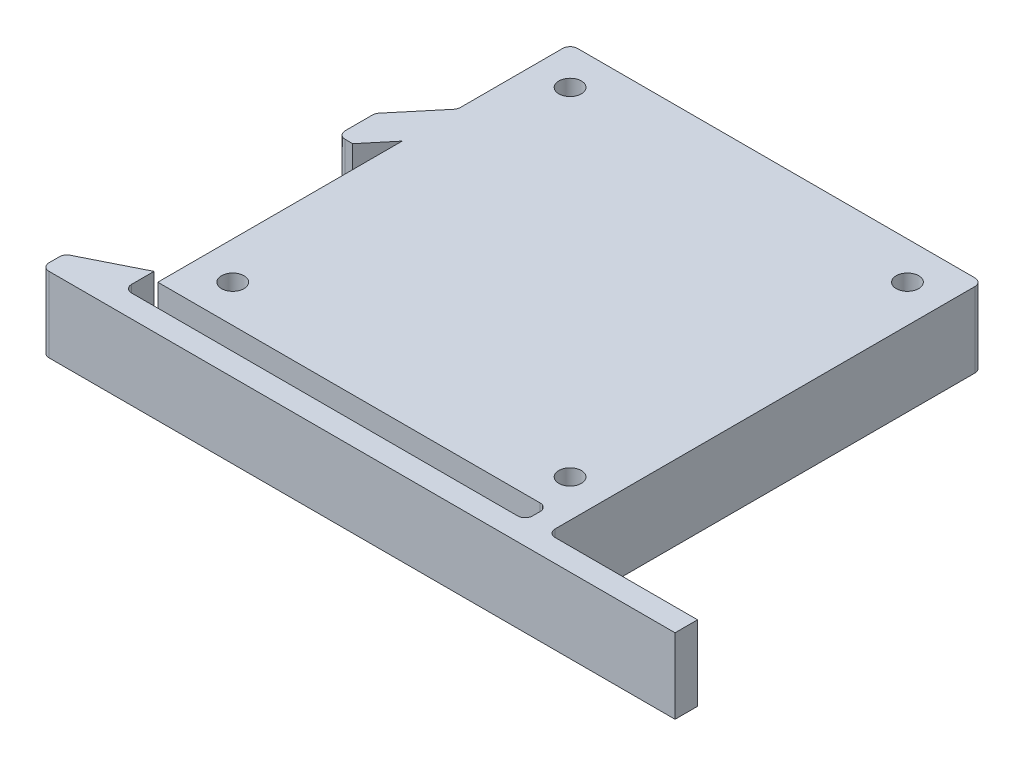
ISO-10303-21;
HEADER;
FILE_DESCRIPTION(('STEP AP214'),'2;1');
FILE_NAME('part.step','',(''),(''),'','','');
FILE_SCHEMA(('AUTOMOTIVE_DESIGN { 1 0 10303 214 1 1 1 1 }'));
ENDSEC;
DATA;
#1=APPLICATION_CONTEXT('core data for automotive mechanical design processes');
#2=APPLICATION_PROTOCOL_DEFINITION('international standard','automotive_design',2000,#1);
#3=PRODUCT_CONTEXT('',#1,'mechanical');
#4=PRODUCT('Part','Part','',(#3));
#5=PRODUCT_RELATED_PRODUCT_CATEGORY('part','',(#4));
#6=PRODUCT_DEFINITION_FORMATION('','',#4);
#7=PRODUCT_DEFINITION_CONTEXT('part definition',#1,'design');
#8=PRODUCT_DEFINITION('design','',#6,#7);
#9=PRODUCT_DEFINITION_SHAPE('','',#8);
#10=(LENGTH_UNIT() NAMED_UNIT(*) SI_UNIT(.MILLI.,.METRE.));
#11=(NAMED_UNIT(*) PLANE_ANGLE_UNIT() SI_UNIT($,.RADIAN.));
#12=(NAMED_UNIT(*) SI_UNIT($,.STERADIAN.) SOLID_ANGLE_UNIT());
#13=UNCERTAINTY_MEASURE_WITH_UNIT(LENGTH_MEASURE(1.E-05),#10,'distance_accuracy_value','');
#14=(GEOMETRIC_REPRESENTATION_CONTEXT(3) GLOBAL_UNCERTAINTY_ASSIGNED_CONTEXT((#13)) GLOBAL_UNIT_ASSIGNED_CONTEXT((#10,
#11,#12)) REPRESENTATION_CONTEXT('',''));
#15=CARTESIAN_POINT('',(0.,0.,0.));
#16=DIRECTION('',(0.,0.,1.));
#17=DIRECTION('',(1.,0.,0.));
#18=AXIS2_PLACEMENT_3D('',#15,#16,#17);
#19=CARTESIAN_POINT('',(51.,10.,-5.));
#20=DIRECTION('',(0.,-1.,0.));
#21=DIRECTION('',(0.,0.,-1.));
#22=AXIS2_PLACEMENT_3D('',#19,#20,#21);
#23=PLANE('',#22);
#24=DIRECTION('',(0.640184399664479,0.,-0.768221279597376));
#25=VECTOR('',#24,1.);
#26=CARTESIAN_POINT('',(-3.,10.,-35.));
#27=LINE('',#26,#25);
#28=CARTESIAN_POINT('',(-3.,10.,-35.));
#29=VERTEX_POINT('',#28);
#30=CARTESIAN_POINT('',(0.,10.,-38.6));
#31=VERTEX_POINT('',#30);
#32=EDGE_CURVE('E311',#29,#31,#27,.T.);
#33=ORIENTED_EDGE('',*,*,#32,.T.);
#34=DIRECTION('',(0.,0.,1.));
#35=VECTOR('',#34,1.);
#36=CARTESIAN_POINT('',(0.,10.,-38.6));
#37=LINE('',#36,#35);
#38=CARTESIAN_POINT('',(0.,10.,-6.));
#39=VERTEX_POINT('',#38);
#40=EDGE_CURVE('E159',#31,#39,#37,.T.);
#41=ORIENTED_EDGE('',*,*,#40,.T.);
#42=DIRECTION('',(1.,0.,0.));
#43=VECTOR('',#42,1.);
#44=CARTESIAN_POINT('',(0.,10.,-6.));
#45=LINE('',#44,#43);
#46=CARTESIAN_POINT('',(51.,10.,-6.));
#47=VERTEX_POINT('',#46);
#48=EDGE_CURVE('E386',#39,#47,#45,.T.);
#49=ORIENTED_EDGE('',*,*,#48,.T.);
#50=CARTESIAN_POINT('',(51.,10.,-5.));
#51=DIRECTION('',(0.,-1.,0.));
#52=DIRECTION('',(0.,0.,-1.));
#53=AXIS2_PLACEMENT_3D('',#50,#51,#52);
#54=CIRCLE('',#53,1.);
#55=CARTESIAN_POINT('',(52.,10.,-5.));
#56=VERTEX_POINT('',#55);
#57=EDGE_CURVE('E405',#47,#56,#54,.T.);
#58=ORIENTED_EDGE('',*,*,#57,.T.);
#59=DIRECTION('',(0.,0.,1.));
#60=VECTOR('',#59,1.);
#61=CARTESIAN_POINT('',(52.,10.,-4.));
#62=LINE('',#61,#60);
#63=CARTESIAN_POINT('',(52.,10.,-4.));
#64=VERTEX_POINT('',#63);
#65=EDGE_CURVE('E402',#56,#64,#62,.T.);
#66=ORIENTED_EDGE('',*,*,#65,.T.);
#67=CARTESIAN_POINT('',(51.,10.,-4.));
#68=DIRECTION('',(0.,-1.,0.));
#69=DIRECTION('',(0.,0.,-1.));
#70=AXIS2_PLACEMENT_3D('',#67,#68,#69);
#71=CIRCLE('',#70,1.);
#72=CARTESIAN_POINT('',(51.,10.,-3.));
#73=VERTEX_POINT('',#72);
#74=EDGE_CURVE('E404',#64,#73,#71,.T.);
#75=ORIENTED_EDGE('',*,*,#74,.T.);
#76=DIRECTION('',(-1.,0.,0.));
#77=VECTOR('',#76,1.);
#78=CARTESIAN_POINT('',(51.,10.,-3.));
#79=LINE('',#78,#77);
#80=CARTESIAN_POINT('',(-0.499999999999995,10.,-2.99999999999999));
#81=VERTEX_POINT('',#80);
#82=EDGE_CURVE('E407',#73,#81,#79,.T.);
#83=ORIENTED_EDGE('',*,*,#82,.T.);
#84=CARTESIAN_POINT('',(-0.499999999999995,10.,-3.99999999999999));
#85=DIRECTION('',(0.,-1.,0.));
#86=DIRECTION('',(0.,0.,-1.));
#87=AXIS2_PLACEMENT_3D('',#84,#85,#86);
#88=CIRCLE('',#87,1.);
#89=CARTESIAN_POINT('',(-1.5,10.,-3.99999999999999));
#90=VERTEX_POINT('',#89);
#91=EDGE_CURVE('E413',#81,#90,#88,.T.);
#92=ORIENTED_EDGE('',*,*,#91,.T.);
#93=DIRECTION('',(0.,0.,-1.));
#94=VECTOR('',#93,1.);
#95=CARTESIAN_POINT('',(-1.5,10.,-3.99999999999999));
#96=LINE('',#95,#94);
#97=CARTESIAN_POINT('',(-1.5,10.,-7.));
#98=VERTEX_POINT('',#97);
#99=EDGE_CURVE('E415',#90,#98,#96,.T.);
#100=ORIENTED_EDGE('',*,*,#99,.T.);
#101=DIRECTION('',(-0.894427190999916,0.,0.447213595499957));
#102=VECTOR('',#101,1.);
#103=CARTESIAN_POINT('',(-1.5,10.,-7.));
#104=LINE('',#103,#102);
#105=CARTESIAN_POINT('',(-8.94721359549995,10.,-3.27639320225004));
#106=VERTEX_POINT('',#105);
#107=EDGE_CURVE('E417',#98,#106,#104,.T.);
#108=ORIENTED_EDGE('',*,*,#107,.T.);
#109=CARTESIAN_POINT('',(-8.5,10.,-2.38196601125012));
#110=DIRECTION('',(0.,1.,0.));
#111=DIRECTION('',(0.,0.,1.));
#112=AXIS2_PLACEMENT_3D('',#109,#110,#111);
#113=CIRCLE('',#112,0.999999999999999);
#114=CARTESIAN_POINT('',(-9.5,10.,-2.38196601125011));
#115=VERTEX_POINT('',#114);
#116=EDGE_CURVE('E419',#106,#115,#113,.T.);
#117=ORIENTED_EDGE('',*,*,#116,.T.);
#118=DIRECTION('',(0.,0.,1.));
#119=VECTOR('',#118,1.);
#120=CARTESIAN_POINT('',(-9.5,10.,-1.00000000000001));
#121=LINE('',#120,#119);
#122=CARTESIAN_POINT('',(-9.5,10.,-1.00000000000001));
#123=VERTEX_POINT('',#122);
#124=EDGE_CURVE('E421',#115,#123,#121,.T.);
#125=ORIENTED_EDGE('',*,*,#124,.T.);
#126=CARTESIAN_POINT('',(-8.5,10.,-1.));
#127=DIRECTION('',(0.,1.,0.));
#128=DIRECTION('',(0.,0.,-1.));
#129=AXIS2_PLACEMENT_3D('',#126,#127,#128);
#130=CIRCLE('',#129,1.);
#131=CARTESIAN_POINT('',(-8.49999999999999,10.,0.));
#132=VERTEX_POINT('',#131);
#133=EDGE_CURVE('E423',#123,#132,#130,.T.);
#134=ORIENTED_EDGE('',*,*,#133,.T.);
#135=DIRECTION('',(1.,0.,0.));
#136=VECTOR('',#135,1.);
#137=CARTESIAN_POINT('',(75.,10.,0.));
#138=LINE('',#137,#136);
#139=CARTESIAN_POINT('',(75.,10.,0.));
#140=VERTEX_POINT('',#139);
#141=EDGE_CURVE('E425',#132,#140,#138,.T.);
#142=ORIENTED_EDGE('',*,*,#141,.T.);
#143=DIRECTION('',(0.,0.,-1.));
#144=VECTOR('',#143,1.);
#145=CARTESIAN_POINT('',(75.,10.,0.));
#146=LINE('',#145,#144);
#147=CARTESIAN_POINT('',(75.,10.,-3.));
#148=VERTEX_POINT('',#147);
#149=EDGE_CURVE('E427',#140,#148,#146,.T.);
#150=ORIENTED_EDGE('',*,*,#149,.T.);
#151=DIRECTION('',(-1.,0.,0.));
#152=VECTOR('',#151,1.);
#153=CARTESIAN_POINT('',(75.,10.,-3.));
#154=LINE('',#153,#152);
#155=CARTESIAN_POINT('',(56.,10.,-3.));
#156=VERTEX_POINT('',#155);
#157=EDGE_CURVE('E429',#148,#156,#154,.T.);
#158=ORIENTED_EDGE('',*,*,#157,.T.);
#159=CARTESIAN_POINT('',(56.,10.,-4.));
#160=DIRECTION('',(0.,-1.,0.));
#161=DIRECTION('',(0.,0.,-1.));
#162=AXIS2_PLACEMENT_3D('',#159,#160,#161);
#163=CIRCLE('',#162,1.);
#164=CARTESIAN_POINT('',(55.,10.,-4.));
#165=VERTEX_POINT('',#164);
#166=EDGE_CURVE('E431',#156,#165,#163,.T.);
#167=ORIENTED_EDGE('',*,*,#166,.T.);
#168=DIRECTION('',(0.,0.,-1.));
#169=VECTOR('',#168,1.);
#170=CARTESIAN_POINT('',(55.,10.,-4.));
#171=LINE('',#170,#169);
#172=CARTESIAN_POINT('',(55.,10.,-60.));
#173=VERTEX_POINT('',#172);
#174=EDGE_CURVE('E433',#165,#173,#171,.T.);
#175=ORIENTED_EDGE('',*,*,#174,.T.);
#176=CARTESIAN_POINT('',(54.,10.,-60.));
#177=DIRECTION('',(0.,1.,0.));
#178=DIRECTION('',(0.,0.,1.));
#179=AXIS2_PLACEMENT_3D('',#176,#177,#178);
#180=CIRCLE('',#179,0.999999999999997);
#181=CARTESIAN_POINT('',(54.,10.,-61.));
#182=VERTEX_POINT('',#181);
#183=EDGE_CURVE('E435',#173,#182,#180,.T.);
#184=ORIENTED_EDGE('',*,*,#183,.T.);
#185=DIRECTION('',(-1.,0.,0.));
#186=VECTOR('',#185,1.);
#187=CARTESIAN_POINT('',(54.,10.,-61.));
#188=LINE('',#187,#186);
#189=CARTESIAN_POINT('',(1.,10.,-61.));
#190=VERTEX_POINT('',#189);
#191=EDGE_CURVE('E437',#182,#190,#188,.T.);
#192=ORIENTED_EDGE('',*,*,#191,.T.);
#193=CARTESIAN_POINT('',(1.,10.,-60.));
#194=DIRECTION('',(0.,1.,0.));
#195=DIRECTION('',(0.,0.,1.));
#196=AXIS2_PLACEMENT_3D('',#193,#194,#195);
#197=CIRCLE('',#196,1.);
#198=CARTESIAN_POINT('',(0.,10.,-60.));
#199=VERTEX_POINT('',#198);
#200=EDGE_CURVE('E439',#190,#199,#197,.T.);
#201=ORIENTED_EDGE('',*,*,#200,.T.);
#202=DIRECTION('',(0.,0.,1.));
#203=VECTOR('',#202,1.);
#204=CARTESIAN_POINT('',(0.,10.,-60.));
#205=LINE('',#204,#203);
#206=CARTESIAN_POINT('',(0.,10.,-46.3620499351813));
#207=VERTEX_POINT('',#206);
#208=EDGE_CURVE('E441',#199,#207,#205,.T.);
#209=ORIENTED_EDGE('',*,*,#208,.T.);
#210=CARTESIAN_POINT('',(-0.999999999999998,10.,-46.3620499351813));
#211=DIRECTION('',(0.,-1.,0.));
#212=DIRECTION('',(0.,0.,-1.));
#213=AXIS2_PLACEMENT_3D('',#210,#211,#212);
#214=CIRCLE('',#213,0.999999999999997);
#215=CARTESIAN_POINT('',(-0.231778720402629,10.,-45.7218655355168));
#216=VERTEX_POINT('',#215);
#217=EDGE_CURVE('E443',#207,#216,#214,.T.);
#218=ORIENTED_EDGE('',*,*,#217,.T.);
#219=DIRECTION('',(-0.640184399664479,0.,0.768221279597376));
#220=VECTOR('',#219,1.);
#221=CARTESIAN_POINT('',(-0.231778720402629,10.,-45.7218655355168));
#222=LINE('',#221,#220);
#223=CARTESIAN_POINT('',(-4.76822127959737,10.,-40.2781344644831));
#224=VERTEX_POINT('',#223);
#225=EDGE_CURVE('E445',#216,#224,#222,.T.);
#226=ORIENTED_EDGE('',*,*,#225,.T.);
#227=CARTESIAN_POINT('',(-4.,10.,-39.6379500648187));
#228=DIRECTION('',(0.,1.,0.));
#229=DIRECTION('',(0.,0.,1.));
#230=AXIS2_PLACEMENT_3D('',#227,#228,#229);
#231=CIRCLE('',#230,0.999999999999997);
#232=CARTESIAN_POINT('',(-5.,10.,-39.6379500648187));
#233=VERTEX_POINT('',#232);
#234=EDGE_CURVE('E238',#224,#233,#231,.T.);
#235=ORIENTED_EDGE('',*,*,#234,.T.);
#236=DIRECTION('',(0.,0.,1.));
#237=VECTOR('',#236,1.);
#238=CARTESIAN_POINT('',(-5.,10.,-39.6379500648187));
#239=LINE('',#238,#237);
#240=CARTESIAN_POINT('',(-5.,10.,-36.));
#241=VERTEX_POINT('',#240);
#242=EDGE_CURVE('E232',#233,#241,#239,.T.);
#243=ORIENTED_EDGE('',*,*,#242,.T.);
#244=CARTESIAN_POINT('',(-4.,10.,-36.));
#245=DIRECTION('',(0.,1.,0.));
#246=DIRECTION('',(0.,0.,1.));
#247=AXIS2_PLACEMENT_3D('',#244,#245,#246);
#248=CIRCLE('',#247,1.);
#249=CARTESIAN_POINT('',(-4.,10.,-35.));
#250=VERTEX_POINT('',#249);
#251=EDGE_CURVE('E236',#241,#250,#248,.T.);
#252=ORIENTED_EDGE('',*,*,#251,.T.);
#253=DIRECTION('',(1.,0.,0.));
#254=VECTOR('',#253,1.);
#255=CARTESIAN_POINT('',(-4.,10.,-35.));
#256=LINE('',#255,#254);
#257=EDGE_CURVE('E56',#250,#29,#256,.T.);
#258=ORIENTED_EDGE('',*,*,#257,.T.);
#259=EDGE_LOOP('',(#33,#41,#49,#58,#66,#75,#83,#92,#100,#108,#117,#125,#134,#142,#150,#158,#167,
#175,#184,#192,#201,#209,#218,#226,#235,#243,#252,#258));
#260=FACE_BOUND('',#259,.T.);
#261=CARTESIAN_POINT('',(5.,10.,-56.));
#262=DIRECTION('',(0.,1.,0.));
#263=DIRECTION('',(0.,0.,1.));
#264=AXIS2_PLACEMENT_3D('',#261,#262,#263);
#265=CIRCLE('',#264,1.5);
#266=CARTESIAN_POINT('',(5.,10.,-54.5));
#267=VERTEX_POINT('',#266);
#268=EDGE_CURVE('E260',#267,#267,#265,.T.);
#269=ORIENTED_EDGE('',*,*,#268,.F.);
#270=EDGE_LOOP('',(#269));
#271=FACE_BOUND('',#270,.T.);
#272=CARTESIAN_POINT('',(50.,10.,-56.));
#273=DIRECTION('',(0.,1.,0.));
#274=DIRECTION('',(0.,0.,1.));
#275=AXIS2_PLACEMENT_3D('',#272,#273,#274);
#276=CIRCLE('',#275,1.5);
#277=CARTESIAN_POINT('',(50.,10.,-54.5));
#278=VERTEX_POINT('',#277);
#279=EDGE_CURVE('E509',#278,#278,#276,.T.);
#280=ORIENTED_EDGE('',*,*,#279,.F.);
#281=EDGE_LOOP('',(#280));
#282=FACE_BOUND('',#281,.T.);
#283=CARTESIAN_POINT('',(5.,10.,-11.));
#284=DIRECTION('',(0.,1.,0.));
#285=DIRECTION('',(0.,0.,1.));
#286=AXIS2_PLACEMENT_3D('',#283,#284,#285);
#287=CIRCLE('',#286,1.5);
#288=CARTESIAN_POINT('',(5.,10.,-9.49999999999999));
#289=VERTEX_POINT('',#288);
#290=EDGE_CURVE('E503',#289,#289,#287,.T.);
#291=ORIENTED_EDGE('',*,*,#290,.F.);
#292=EDGE_LOOP('',(#291));
#293=FACE_BOUND('',#292,.T.);
#294=CARTESIAN_POINT('',(50.,10.,-11.));
#295=DIRECTION('',(0.,1.,0.));
#296=DIRECTION('',(0.,0.,1.));
#297=AXIS2_PLACEMENT_3D('',#294,#295,#296);
#298=CIRCLE('',#297,1.5);
#299=CARTESIAN_POINT('',(50.,10.,-9.49999999999998));
#300=VERTEX_POINT('',#299);
#301=EDGE_CURVE('E494',#300,#300,#298,.T.);
#302=ORIENTED_EDGE('',*,*,#301,.F.);
#303=EDGE_LOOP('',(#302));
#304=FACE_BOUND('',#303,.T.);
#305=ADVANCED_FACE('F39',(#260,#271,#282,#293,#304),#23,.F.);
#306=CARTESIAN_POINT('',(51.,0.,-5.));
#307=DIRECTION('',(0.,-1.,0.));
#308=DIRECTION('',(0.,0.,-1.));
#309=AXIS2_PLACEMENT_3D('',#306,#307,#308);
#310=PLANE('',#309);
#311=CARTESIAN_POINT('',(5.,0.,-11.));
#312=DIRECTION('',(0.,1.,0.));
#313=DIRECTION('',(0.,0.,1.));
#314=AXIS2_PLACEMENT_3D('',#311,#312,#313);
#315=CIRCLE('',#314,1.5);
#316=CARTESIAN_POINT('',(5.,0.,-9.49999999999999));
#317=VERTEX_POINT('',#316);
#318=EDGE_CURVE('E500',#317,#317,#315,.T.);
#319=ORIENTED_EDGE('',*,*,#318,.T.);
#320=EDGE_LOOP('',(#319));
#321=FACE_BOUND('',#320,.T.);
#322=CARTESIAN_POINT('',(5.,0.,-56.));
#323=DIRECTION('',(0.,1.,0.));
#324=DIRECTION('',(0.,0.,1.));
#325=AXIS2_PLACEMENT_3D('',#322,#323,#324);
#326=CIRCLE('',#325,1.5);
#327=CARTESIAN_POINT('',(5.,0.,-54.5));
#328=VERTEX_POINT('',#327);
#329=EDGE_CURVE('E512',#328,#328,#326,.T.);
#330=ORIENTED_EDGE('',*,*,#329,.T.);
#331=EDGE_LOOP('',(#330));
#332=FACE_BOUND('',#331,.T.);
#333=DIRECTION('',(0.640184399664479,0.,-0.768221279597376));
#334=VECTOR('',#333,1.);
#335=CARTESIAN_POINT('',(-3.,0.,-35.));
#336=LINE('',#335,#334);
#337=CARTESIAN_POINT('',(-3.,0.,-35.));
#338=VERTEX_POINT('',#337);
#339=CARTESIAN_POINT('',(0.,0.,-38.6));
#340=VERTEX_POINT('',#339);
#341=EDGE_CURVE('E256',#338,#340,#336,.T.);
#342=ORIENTED_EDGE('',*,*,#341,.F.);
#343=DIRECTION('',(1.,0.,0.));
#344=VECTOR('',#343,1.);
#345=CARTESIAN_POINT('',(-4.,0.,-35.));
#346=LINE('',#345,#344);
#347=CARTESIAN_POINT('',(-4.,0.,-35.));
#348=VERTEX_POINT('',#347);
#349=EDGE_CURVE('E151',#348,#338,#346,.T.);
#350=ORIENTED_EDGE('',*,*,#349,.F.);
#351=CARTESIAN_POINT('',(-4.,0.,-36.));
#352=DIRECTION('',(0.,1.,0.));
#353=DIRECTION('',(0.,0.,1.));
#354=AXIS2_PLACEMENT_3D('',#351,#352,#353);
#355=CIRCLE('',#354,1.);
#356=CARTESIAN_POINT('',(-5.,0.,-36.));
#357=VERTEX_POINT('',#356);
#358=EDGE_CURVE('E145',#357,#348,#355,.T.);
#359=ORIENTED_EDGE('',*,*,#358,.F.);
#360=DIRECTION('',(0.,0.,1.));
#361=VECTOR('',#360,1.);
#362=CARTESIAN_POINT('',(-5.,0.,-39.6379500648187));
#363=LINE('',#362,#361);
#364=CARTESIAN_POINT('',(-5.,0.,-39.6379500648187));
#365=VERTEX_POINT('',#364);
#366=EDGE_CURVE('E246',#365,#357,#363,.T.);
#367=ORIENTED_EDGE('',*,*,#366,.F.);
#368=CARTESIAN_POINT('',(-4.,0.,-39.6379500648187));
#369=DIRECTION('',(0.,1.,0.));
#370=DIRECTION('',(0.,0.,1.));
#371=AXIS2_PLACEMENT_3D('',#368,#369,#370);
#372=CIRCLE('',#371,0.999999999999997);
#373=CARTESIAN_POINT('',(-4.76822127959737,0.,-40.2781344644831));
#374=VERTEX_POINT('',#373);
#375=EDGE_CURVE('E306',#374,#365,#372,.T.);
#376=ORIENTED_EDGE('',*,*,#375,.F.);
#377=DIRECTION('',(-0.640184399664479,0.,0.768221279597376));
#378=VECTOR('',#377,1.);
#379=CARTESIAN_POINT('',(-0.231778720402629,0.,-45.7218655355168));
#380=LINE('',#379,#378);
#381=CARTESIAN_POINT('',(-0.231778720402629,0.,-45.7218655355168));
#382=VERTEX_POINT('',#381);
#383=EDGE_CURVE('E304',#382,#374,#380,.T.);
#384=ORIENTED_EDGE('',*,*,#383,.F.);
#385=CARTESIAN_POINT('',(-0.999999999999998,0.,-46.3620499351813));
#386=DIRECTION('',(0.,-1.,0.));
#387=DIRECTION('',(0.,0.,-1.));
#388=AXIS2_PLACEMENT_3D('',#385,#386,#387);
#389=CIRCLE('',#388,0.999999999999997);
#390=CARTESIAN_POINT('',(0.,0.,-46.3620499351813));
#391=VERTEX_POINT('',#390);
#392=EDGE_CURVE('E302',#391,#382,#389,.T.);
#393=ORIENTED_EDGE('',*,*,#392,.F.);
#394=DIRECTION('',(0.,0.,1.));
#395=VECTOR('',#394,1.);
#396=CARTESIAN_POINT('',(0.,0.,-60.));
#397=LINE('',#396,#395);
#398=CARTESIAN_POINT('',(0.,0.,-60.));
#399=VERTEX_POINT('',#398);
#400=EDGE_CURVE('E300',#399,#391,#397,.T.);
#401=ORIENTED_EDGE('',*,*,#400,.F.);
#402=CARTESIAN_POINT('',(1.,0.,-60.));
#403=DIRECTION('',(0.,1.,0.));
#404=DIRECTION('',(0.,0.,1.));
#405=AXIS2_PLACEMENT_3D('',#402,#403,#404);
#406=CIRCLE('',#405,1.);
#407=CARTESIAN_POINT('',(1.,0.,-61.));
#408=VERTEX_POINT('',#407);
#409=EDGE_CURVE('E298',#408,#399,#406,.T.);
#410=ORIENTED_EDGE('',*,*,#409,.F.);
#411=DIRECTION('',(-1.,0.,0.));
#412=VECTOR('',#411,1.);
#413=CARTESIAN_POINT('',(54.,0.,-61.));
#414=LINE('',#413,#412);
#415=CARTESIAN_POINT('',(54.,0.,-61.));
#416=VERTEX_POINT('',#415);
#417=EDGE_CURVE('E296',#416,#408,#414,.T.);
#418=ORIENTED_EDGE('',*,*,#417,.F.);
#419=CARTESIAN_POINT('',(54.,0.,-60.));
#420=DIRECTION('',(0.,1.,0.));
#421=DIRECTION('',(0.,0.,1.));
#422=AXIS2_PLACEMENT_3D('',#419,#420,#421);
#423=CIRCLE('',#422,0.999999999999997);
#424=CARTESIAN_POINT('',(55.,0.,-60.));
#425=VERTEX_POINT('',#424);
#426=EDGE_CURVE('E294',#425,#416,#423,.T.);
#427=ORIENTED_EDGE('',*,*,#426,.F.);
#428=DIRECTION('',(0.,0.,-1.));
#429=VECTOR('',#428,1.);
#430=CARTESIAN_POINT('',(55.,0.,-4.));
#431=LINE('',#430,#429);
#432=CARTESIAN_POINT('',(55.,0.,-4.));
#433=VERTEX_POINT('',#432);
#434=EDGE_CURVE('E292',#433,#425,#431,.T.);
#435=ORIENTED_EDGE('',*,*,#434,.F.);
#436=CARTESIAN_POINT('',(56.,0.,-4.));
#437=DIRECTION('',(0.,-1.,0.));
#438=DIRECTION('',(0.,0.,-1.));
#439=AXIS2_PLACEMENT_3D('',#436,#437,#438);
#440=CIRCLE('',#439,1.);
#441=CARTESIAN_POINT('',(56.,0.,-3.));
#442=VERTEX_POINT('',#441);
#443=EDGE_CURVE('E290',#442,#433,#440,.T.);
#444=ORIENTED_EDGE('',*,*,#443,.F.);
#445=DIRECTION('',(-1.,0.,0.));
#446=VECTOR('',#445,1.);
#447=CARTESIAN_POINT('',(75.,0.,-3.));
#448=LINE('',#447,#446);
#449=CARTESIAN_POINT('',(75.,0.,-3.));
#450=VERTEX_POINT('',#449);
#451=EDGE_CURVE('E288',#450,#442,#448,.T.);
#452=ORIENTED_EDGE('',*,*,#451,.F.);
#453=DIRECTION('',(0.,0.,-1.));
#454=VECTOR('',#453,1.);
#455=CARTESIAN_POINT('',(75.,0.,0.));
#456=LINE('',#455,#454);
#457=CARTESIAN_POINT('',(75.,0.,0.));
#458=VERTEX_POINT('',#457);
#459=EDGE_CURVE('E286',#458,#450,#456,.T.);
#460=ORIENTED_EDGE('',*,*,#459,.F.);
#461=DIRECTION('',(1.,0.,0.));
#462=VECTOR('',#461,1.);
#463=CARTESIAN_POINT('',(75.,0.,0.));
#464=LINE('',#463,#462);
#465=CARTESIAN_POINT('',(-8.49999999999999,0.,0.));
#466=VERTEX_POINT('',#465);
#467=EDGE_CURVE('E284',#466,#458,#464,.T.);
#468=ORIENTED_EDGE('',*,*,#467,.F.);
#469=CARTESIAN_POINT('',(-8.5,0.,-1.));
#470=DIRECTION('',(0.,1.,0.));
#471=DIRECTION('',(0.,0.,-1.));
#472=AXIS2_PLACEMENT_3D('',#469,#470,#471);
#473=CIRCLE('',#472,1.);
#474=CARTESIAN_POINT('',(-9.5,0.,-1.00000000000001));
#475=VERTEX_POINT('',#474);
#476=EDGE_CURVE('E282',#475,#466,#473,.T.);
#477=ORIENTED_EDGE('',*,*,#476,.F.);
#478=DIRECTION('',(0.,0.,1.));
#479=VECTOR('',#478,1.);
#480=CARTESIAN_POINT('',(-9.5,0.,-1.00000000000001));
#481=LINE('',#480,#479);
#482=CARTESIAN_POINT('',(-9.5,0.,-2.38196601125011));
#483=VERTEX_POINT('',#482);
#484=EDGE_CURVE('E280',#483,#475,#481,.T.);
#485=ORIENTED_EDGE('',*,*,#484,.F.);
#486=CARTESIAN_POINT('',(-8.5,0.,-2.38196601125012));
#487=DIRECTION('',(0.,1.,0.));
#488=DIRECTION('',(0.,0.,1.));
#489=AXIS2_PLACEMENT_3D('',#486,#487,#488);
#490=CIRCLE('',#489,0.999999999999999);
#491=CARTESIAN_POINT('',(-8.94721359549995,0.,-3.27639320225004));
#492=VERTEX_POINT('',#491);
#493=EDGE_CURVE('E278',#492,#483,#490,.T.);
#494=ORIENTED_EDGE('',*,*,#493,.F.);
#495=DIRECTION('',(-0.894427190999916,0.,0.447213595499957));
#496=VECTOR('',#495,1.);
#497=CARTESIAN_POINT('',(-1.5,0.,-7.));
#498=LINE('',#497,#496);
#499=CARTESIAN_POINT('',(-1.5,0.,-7.));
#500=VERTEX_POINT('',#499);
#501=EDGE_CURVE('E276',#500,#492,#498,.T.);
#502=ORIENTED_EDGE('',*,*,#501,.F.);
#503=DIRECTION('',(0.,0.,-1.));
#504=VECTOR('',#503,1.);
#505=CARTESIAN_POINT('',(-1.5,0.,-3.99999999999999));
#506=LINE('',#505,#504);
#507=CARTESIAN_POINT('',(-1.5,0.,-3.99999999999999));
#508=VERTEX_POINT('',#507);
#509=EDGE_CURVE('E274',#508,#500,#506,.T.);
#510=ORIENTED_EDGE('',*,*,#509,.F.);
#511=CARTESIAN_POINT('',(-0.499999999999995,0.,-3.99999999999999));
#512=DIRECTION('',(0.,-1.,0.));
#513=DIRECTION('',(0.,0.,-1.));
#514=AXIS2_PLACEMENT_3D('',#511,#512,#513);
#515=CIRCLE('',#514,1.);
#516=CARTESIAN_POINT('',(-0.499999999999995,0.,-2.99999999999999));
#517=VERTEX_POINT('',#516);
#518=EDGE_CURVE('E272',#517,#508,#515,.T.);
#519=ORIENTED_EDGE('',*,*,#518,.F.);
#520=DIRECTION('',(-1.,0.,0.));
#521=VECTOR('',#520,1.);
#522=CARTESIAN_POINT('',(51.,0.,-3.));
#523=LINE('',#522,#521);
#524=CARTESIAN_POINT('',(51.,0.,-3.));
#525=VERTEX_POINT('',#524);
#526=EDGE_CURVE('E270',#525,#517,#523,.T.);
#527=ORIENTED_EDGE('',*,*,#526,.F.);
#528=CARTESIAN_POINT('',(51.,0.,-4.));
#529=DIRECTION('',(0.,-1.,0.));
#530=DIRECTION('',(0.,0.,-1.));
#531=AXIS2_PLACEMENT_3D('',#528,#529,#530);
#532=CIRCLE('',#531,1.);
#533=CARTESIAN_POINT('',(52.,0.,-4.));
#534=VERTEX_POINT('',#533);
#535=EDGE_CURVE('E268',#534,#525,#532,.T.);
#536=ORIENTED_EDGE('',*,*,#535,.F.);
#537=DIRECTION('',(0.,0.,1.));
#538=VECTOR('',#537,1.);
#539=CARTESIAN_POINT('',(52.,0.,-4.));
#540=LINE('',#539,#538);
#541=CARTESIAN_POINT('',(52.,0.,-5.));
#542=VERTEX_POINT('',#541);
#543=EDGE_CURVE('E266',#542,#534,#540,.T.);
#544=ORIENTED_EDGE('',*,*,#543,.F.);
#545=CARTESIAN_POINT('',(51.,0.,-5.));
#546=DIRECTION('',(0.,-1.,0.));
#547=DIRECTION('',(0.,0.,-1.));
#548=AXIS2_PLACEMENT_3D('',#545,#546,#547);
#549=CIRCLE('',#548,1.);
#550=CARTESIAN_POINT('',(51.,0.,-6.));
#551=VERTEX_POINT('',#550);
#552=EDGE_CURVE('E264',#551,#542,#549,.T.);
#553=ORIENTED_EDGE('',*,*,#552,.F.);
#554=DIRECTION('',(1.,0.,0.));
#555=VECTOR('',#554,1.);
#556=CARTESIAN_POINT('',(0.,0.,-6.));
#557=LINE('',#556,#555);
#558=CARTESIAN_POINT('',(0.,0.,-6.));
#559=VERTEX_POINT('',#558);
#560=EDGE_CURVE('E262',#559,#551,#557,.T.);
#561=ORIENTED_EDGE('',*,*,#560,.F.);
#562=DIRECTION('',(0.,0.,1.));
#563=VECTOR('',#562,1.);
#564=CARTESIAN_POINT('',(0.,0.,-38.6));
#565=LINE('',#564,#563);
#566=EDGE_CURVE('E259',#340,#559,#565,.T.);
#567=ORIENTED_EDGE('',*,*,#566,.F.);
#568=EDGE_LOOP('',(#342,#350,#359,#367,#376,#384,#393,#401,#410,#418,#427,#435,#444,#452,#460,
#468,#477,#485,#494,#502,#510,#519,#527,#536,#544,#553,#561,#567));
#569=FACE_BOUND('',#568,.T.);
#570=CARTESIAN_POINT('',(50.,0.,-56.));
#571=DIRECTION('',(0.,1.,0.));
#572=DIRECTION('',(0.,0.,1.));
#573=AXIS2_PLACEMENT_3D('',#570,#571,#572);
#574=CIRCLE('',#573,1.5);
#575=CARTESIAN_POINT('',(50.,0.,-54.5));
#576=VERTEX_POINT('',#575);
#577=EDGE_CURVE('E506',#576,#576,#574,.T.);
#578=ORIENTED_EDGE('',*,*,#577,.T.);
#579=EDGE_LOOP('',(#578));
#580=FACE_BOUND('',#579,.T.);
#581=CARTESIAN_POINT('',(50.,0.,-11.));
#582=DIRECTION('',(0.,1.,0.));
#583=DIRECTION('',(0.,0.,1.));
#584=AXIS2_PLACEMENT_3D('',#581,#582,#583);
#585=CIRCLE('',#584,1.5);
#586=CARTESIAN_POINT('',(50.,0.,-9.49999999999998));
#587=VERTEX_POINT('',#586);
#588=EDGE_CURVE('E497',#587,#587,#585,.T.);
#589=ORIENTED_EDGE('',*,*,#588,.T.);
#590=EDGE_LOOP('',(#589));
#591=FACE_BOUND('',#590,.T.);
#592=ADVANCED_FACE('F390',(#321,#332,#569,#580,#591),#310,.T.);
#593=CARTESIAN_POINT('',(-3.,10.,-35.));
#594=DIRECTION('',(-0.768221279597376,0.,-0.640184399664479));
#595=DIRECTION('',(-0.640184399664479,0.,0.768221279597376));
#596=AXIS2_PLACEMENT_3D('',#593,#594,#595);
#597=PLANE('',#596);
#598=ORIENTED_EDGE('',*,*,#341,.T.);
#599=DIRECTION('',(0.,-1.,0.));
#600=VECTOR('',#599,1.);
#601=CARTESIAN_POINT('',(0.,10.,-38.6));
#602=LINE('',#601,#600);
#603=EDGE_CURVE('E11',#31,#340,#602,.T.);
#604=ORIENTED_EDGE('',*,*,#603,.F.);
#605=ORIENTED_EDGE('',*,*,#32,.F.);
#606=DIRECTION('',(0.,-1.,0.));
#607=VECTOR('',#606,1.);
#608=CARTESIAN_POINT('',(-3.,10.,-35.));
#609=LINE('',#608,#607);
#610=EDGE_CURVE('E252',#29,#338,#609,.T.);
#611=ORIENTED_EDGE('',*,*,#610,.T.);
#612=EDGE_LOOP('',(#598,#604,#605,#611));
#613=FACE_BOUND('',#612,.T.);
#614=ADVANCED_FACE('F41',(#613),#597,.F.);
#615=CARTESIAN_POINT('',(0.,10.,-38.6));
#616=DIRECTION('',(1.,0.,0.));
#617=DIRECTION('',(0.,0.,-1.));
#618=AXIS2_PLACEMENT_3D('',#615,#616,#617);
#619=PLANE('',#618);
#620=ORIENTED_EDGE('',*,*,#566,.T.);
#621=DIRECTION('',(0.,-1.,0.));
#622=VECTOR('',#621,1.);
#623=CARTESIAN_POINT('',(0.,10.,-6.));
#624=LINE('',#623,#622);
#625=EDGE_CURVE('E48',#39,#559,#624,.T.);
#626=ORIENTED_EDGE('',*,*,#625,.F.);
#627=ORIENTED_EDGE('',*,*,#40,.F.);
#628=ORIENTED_EDGE('',*,*,#603,.T.);
#629=EDGE_LOOP('',(#620,#626,#627,#628));
#630=FACE_BOUND('',#629,.T.);
#631=ADVANCED_FACE('F788',(#630),#619,.F.);
#632=CARTESIAN_POINT('',(0.,10.,-6.));
#633=DIRECTION('',(0.,0.,-1.));
#634=DIRECTION('',(-1.,0.,0.));
#635=AXIS2_PLACEMENT_3D('',#632,#633,#634);
#636=PLANE('',#635);
#637=ORIENTED_EDGE('',*,*,#560,.T.);
#638=DIRECTION('',(0.,-1.,0.));
#639=VECTOR('',#638,1.);
#640=CARTESIAN_POINT('',(51.,10.,-6.));
#641=LINE('',#640,#639);
#642=EDGE_CURVE('E378',#47,#551,#641,.T.);
#643=ORIENTED_EDGE('',*,*,#642,.F.);
#644=ORIENTED_EDGE('',*,*,#48,.F.);
#645=ORIENTED_EDGE('',*,*,#625,.T.);
#646=EDGE_LOOP('',(#637,#643,#644,#645));
#647=FACE_BOUND('',#646,.T.);
#648=ADVANCED_FACE('F384',(#647),#636,.F.);
#649=CARTESIAN_POINT('',(51.,10.,-5.));
#650=DIRECTION('',(0.,-1.,0.));
#651=DIRECTION('',(0.,0.,-1.));
#652=AXIS2_PLACEMENT_3D('',#649,#650,#651);
#653=CYLINDRICAL_SURFACE('',#652,1.);
#654=ORIENTED_EDGE('',*,*,#552,.T.);
#655=DIRECTION('',(0.,-1.,0.));
#656=VECTOR('',#655,1.);
#657=CARTESIAN_POINT('',(52.,10.,-5.));
#658=LINE('',#657,#656);
#659=EDGE_CURVE('E375',#56,#542,#658,.T.);
#660=ORIENTED_EDGE('',*,*,#659,.F.);
#661=ORIENTED_EDGE('',*,*,#57,.F.);
#662=ORIENTED_EDGE('',*,*,#642,.T.);
#663=EDGE_LOOP('',(#654,#660,#661,#662));
#664=FACE_BOUND('',#663,.T.);
#665=ADVANCED_FACE('F396',(#664),#653,.F.);
#666=CARTESIAN_POINT('',(52.,10.,-4.));
#667=DIRECTION('',(1.,0.,0.));
#668=DIRECTION('',(0.,0.,-1.));
#669=AXIS2_PLACEMENT_3D('',#666,#667,#668);
#670=PLANE('',#669);
#671=ORIENTED_EDGE('',*,*,#543,.T.);
#672=DIRECTION('',(0.,-1.,0.));
#673=VECTOR('',#672,1.);
#674=CARTESIAN_POINT('',(52.,10.,-4.));
#675=LINE('',#674,#673);
#676=EDGE_CURVE('E372',#64,#534,#675,.T.);
#677=ORIENTED_EDGE('',*,*,#676,.F.);
#678=ORIENTED_EDGE('',*,*,#65,.F.);
#679=ORIENTED_EDGE('',*,*,#659,.T.);
#680=EDGE_LOOP('',(#671,#677,#678,#679));
#681=FACE_BOUND('',#680,.T.);
#682=ADVANCED_FACE('F400',(#681),#670,.F.);
#683=CARTESIAN_POINT('',(51.,10.,-4.));
#684=DIRECTION('',(0.,-1.,0.));
#685=DIRECTION('',(0.,0.,-1.));
#686=AXIS2_PLACEMENT_3D('',#683,#684,#685);
#687=CYLINDRICAL_SURFACE('',#686,1.);
#688=ORIENTED_EDGE('',*,*,#535,.T.);
#689=DIRECTION('',(0.,-1.,0.));
#690=VECTOR('',#689,1.);
#691=CARTESIAN_POINT('',(51.,10.,-3.));
#692=LINE('',#691,#690);
#693=EDGE_CURVE('E369',#73,#525,#692,.T.);
#694=ORIENTED_EDGE('',*,*,#693,.F.);
#695=ORIENTED_EDGE('',*,*,#74,.F.);
#696=ORIENTED_EDGE('',*,*,#676,.T.);
#697=EDGE_LOOP('',(#688,#694,#695,#696));
#698=FACE_BOUND('',#697,.T.);
#699=ADVANCED_FACE('F753',(#698),#687,.F.);
#700=CARTESIAN_POINT('',(51.,10.,-3.));
#701=DIRECTION('',(0.,0.,1.));
#702=DIRECTION('',(1.,0.,0.));
#703=AXIS2_PLACEMENT_3D('',#700,#701,#702);
#704=PLANE('',#703);
#705=ORIENTED_EDGE('',*,*,#526,.T.);
#706=DIRECTION('',(0.,-1.,0.));
#707=VECTOR('',#706,1.);
#708=CARTESIAN_POINT('',(-0.499999999999995,10.,-2.99999999999999));
#709=LINE('',#708,#707);
#710=EDGE_CURVE('E366',#81,#517,#709,.T.);
#711=ORIENTED_EDGE('',*,*,#710,.F.);
#712=ORIENTED_EDGE('',*,*,#82,.F.);
#713=ORIENTED_EDGE('',*,*,#693,.T.);
#714=EDGE_LOOP('',(#705,#711,#712,#713));
#715=FACE_BOUND('',#714,.T.);
#716=ADVANCED_FACE('F743',(#715),#704,.F.);
#717=CARTESIAN_POINT('',(-0.499999999999995,10.,-3.99999999999999));
#718=DIRECTION('',(0.,-1.,0.));
#719=DIRECTION('',(0.,0.,-1.));
#720=AXIS2_PLACEMENT_3D('',#717,#718,#719);
#721=CYLINDRICAL_SURFACE('',#720,1.);
#722=ORIENTED_EDGE('',*,*,#518,.T.);
#723=DIRECTION('',(0.,-1.,0.));
#724=VECTOR('',#723,1.);
#725=CARTESIAN_POINT('',(-1.5,10.,-3.99999999999999));
#726=LINE('',#725,#724);
#727=EDGE_CURVE('E363',#90,#508,#726,.T.);
#728=ORIENTED_EDGE('',*,*,#727,.F.);
#729=ORIENTED_EDGE('',*,*,#91,.F.);
#730=ORIENTED_EDGE('',*,*,#710,.T.);
#731=EDGE_LOOP('',(#722,#728,#729,#730));
#732=FACE_BOUND('',#731,.T.);
#733=ADVANCED_FACE('F733',(#732),#721,.F.);
#734=CARTESIAN_POINT('',(-1.5,10.,-3.99999999999999));
#735=DIRECTION('',(-1.,0.,0.));
#736=DIRECTION('',(0.,0.,1.));
#737=AXIS2_PLACEMENT_3D('',#734,#735,#736);
#738=PLANE('',#737);
#739=ORIENTED_EDGE('',*,*,#509,.T.);
#740=DIRECTION('',(0.,-1.,0.));
#741=VECTOR('',#740,1.);
#742=CARTESIAN_POINT('',(-1.5,10.,-7.));
#743=LINE('',#742,#741);
#744=EDGE_CURVE('E360',#98,#500,#743,.T.);
#745=ORIENTED_EDGE('',*,*,#744,.F.);
#746=ORIENTED_EDGE('',*,*,#99,.F.);
#747=ORIENTED_EDGE('',*,*,#727,.T.);
#748=EDGE_LOOP('',(#739,#745,#746,#747));
#749=FACE_BOUND('',#748,.T.);
#750=ADVANCED_FACE('F723',(#749),#738,.F.);
#751=CARTESIAN_POINT('',(-1.5,10.,-7.));
#752=DIRECTION('',(0.447213595499957,0.,0.894427190999917));
#753=DIRECTION('',(0.894427190999917,0.,-0.447213595499957));
#754=AXIS2_PLACEMENT_3D('',#751,#752,#753);
#755=PLANE('',#754);
#756=ORIENTED_EDGE('',*,*,#501,.T.);
#757=DIRECTION('',(0.,-1.,0.));
#758=VECTOR('',#757,1.);
#759=CARTESIAN_POINT('',(-8.94721359549995,10.,-3.27639320225004));
#760=LINE('',#759,#758);
#761=EDGE_CURVE('E357',#106,#492,#760,.T.);
#762=ORIENTED_EDGE('',*,*,#761,.F.);
#763=ORIENTED_EDGE('',*,*,#107,.F.);
#764=ORIENTED_EDGE('',*,*,#744,.T.);
#765=EDGE_LOOP('',(#756,#762,#763,#764));
#766=FACE_BOUND('',#765,.T.);
#767=ADVANCED_FACE('F713',(#766),#755,.F.);
#768=CARTESIAN_POINT('',(-8.5,10.,-2.38196601125012));
#769=DIRECTION('',(0.,-1.,0.));
#770=DIRECTION('',(0.,0.,-1.));
#771=AXIS2_PLACEMENT_3D('',#768,#769,#770);
#772=CYLINDRICAL_SURFACE('',#771,0.999999999999999);
#773=ORIENTED_EDGE('',*,*,#493,.T.);
#774=DIRECTION('',(0.,-1.,0.));
#775=VECTOR('',#774,1.);
#776=CARTESIAN_POINT('',(-9.5,10.,-2.38196601125011));
#777=LINE('',#776,#775);
#778=EDGE_CURVE('E354',#115,#483,#777,.T.);
#779=ORIENTED_EDGE('',*,*,#778,.F.);
#780=ORIENTED_EDGE('',*,*,#116,.F.);
#781=ORIENTED_EDGE('',*,*,#761,.T.);
#782=EDGE_LOOP('',(#773,#779,#780,#781));
#783=FACE_BOUND('',#782,.T.);
#784=ADVANCED_FACE('F703',(#783),#772,.T.);
#785=CARTESIAN_POINT('',(-9.5,10.,-1.00000000000001));
#786=DIRECTION('',(1.,0.,0.));
#787=DIRECTION('',(0.,0.,-1.));
#788=AXIS2_PLACEMENT_3D('',#785,#786,#787);
#789=PLANE('',#788);
#790=ORIENTED_EDGE('',*,*,#484,.T.);
#791=DIRECTION('',(0.,-1.,0.));
#792=VECTOR('',#791,1.);
#793=CARTESIAN_POINT('',(-9.5,10.,-1.00000000000001));
#794=LINE('',#793,#792);
#795=EDGE_CURVE('E351',#123,#475,#794,.T.);
#796=ORIENTED_EDGE('',*,*,#795,.F.);
#797=ORIENTED_EDGE('',*,*,#124,.F.);
#798=ORIENTED_EDGE('',*,*,#778,.T.);
#799=EDGE_LOOP('',(#790,#796,#797,#798));
#800=FACE_BOUND('',#799,.T.);
#801=ADVANCED_FACE('F693',(#800),#789,.F.);
#802=CARTESIAN_POINT('',(-8.5,10.,-1.));
#803=DIRECTION('',(0.,-1.,0.));
#804=DIRECTION('',(0.,0.,-1.));
#805=AXIS2_PLACEMENT_3D('',#802,#803,#804);
#806=CYLINDRICAL_SURFACE('',#805,1.);
#807=ORIENTED_EDGE('',*,*,#476,.T.);
#808=DIRECTION('',(0.,-1.,0.));
#809=VECTOR('',#808,1.);
#810=CARTESIAN_POINT('',(-8.49999999999999,10.,0.));
#811=LINE('',#810,#809);
#812=EDGE_CURVE('E348',#132,#466,#811,.T.);
#813=ORIENTED_EDGE('',*,*,#812,.F.);
#814=ORIENTED_EDGE('',*,*,#133,.F.);
#815=ORIENTED_EDGE('',*,*,#795,.T.);
#816=EDGE_LOOP('',(#807,#813,#814,#815));
#817=FACE_BOUND('',#816,.T.);
#818=ADVANCED_FACE('F683',(#817),#806,.T.);
#819=CARTESIAN_POINT('',(75.,10.,0.));
#820=DIRECTION('',(0.,0.,-1.));
#821=DIRECTION('',(-1.,0.,0.));
#822=AXIS2_PLACEMENT_3D('',#819,#820,#821);
#823=PLANE('',#822);
#824=ORIENTED_EDGE('',*,*,#467,.T.);
#825=DIRECTION('',(0.,-1.,0.));
#826=VECTOR('',#825,1.);
#827=CARTESIAN_POINT('',(75.,10.,0.));
#828=LINE('',#827,#826);
#829=EDGE_CURVE('E345',#140,#458,#828,.T.);
#830=ORIENTED_EDGE('',*,*,#829,.F.);
#831=ORIENTED_EDGE('',*,*,#141,.F.);
#832=ORIENTED_EDGE('',*,*,#812,.T.);
#833=EDGE_LOOP('',(#824,#830,#831,#832));
#834=FACE_BOUND('',#833,.T.);
#835=ADVANCED_FACE('F673',(#834),#823,.F.);
#836=CARTESIAN_POINT('',(75.,10.,0.));
#837=DIRECTION('',(-1.,0.,0.));
#838=DIRECTION('',(0.,0.,1.));
#839=AXIS2_PLACEMENT_3D('',#836,#837,#838);
#840=PLANE('',#839);
#841=ORIENTED_EDGE('',*,*,#459,.T.);
#842=DIRECTION('',(0.,-1.,0.));
#843=VECTOR('',#842,1.);
#844=CARTESIAN_POINT('',(75.,10.,-3.));
#845=LINE('',#844,#843);
#846=EDGE_CURVE('E342',#148,#450,#845,.T.);
#847=ORIENTED_EDGE('',*,*,#846,.F.);
#848=ORIENTED_EDGE('',*,*,#149,.F.);
#849=ORIENTED_EDGE('',*,*,#829,.T.);
#850=EDGE_LOOP('',(#841,#847,#848,#849));
#851=FACE_BOUND('',#850,.T.);
#852=ADVANCED_FACE('F663',(#851),#840,.F.);
#853=CARTESIAN_POINT('',(75.,10.,-3.));
#854=DIRECTION('',(0.,0.,1.));
#855=DIRECTION('',(1.,0.,0.));
#856=AXIS2_PLACEMENT_3D('',#853,#854,#855);
#857=PLANE('',#856);
#858=ORIENTED_EDGE('',*,*,#451,.T.);
#859=DIRECTION('',(0.,-1.,0.));
#860=VECTOR('',#859,1.);
#861=CARTESIAN_POINT('',(56.,10.,-3.));
#862=LINE('',#861,#860);
#863=EDGE_CURVE('E339',#156,#442,#862,.T.);
#864=ORIENTED_EDGE('',*,*,#863,.F.);
#865=ORIENTED_EDGE('',*,*,#157,.F.);
#866=ORIENTED_EDGE('',*,*,#846,.T.);
#867=EDGE_LOOP('',(#858,#864,#865,#866));
#868=FACE_BOUND('',#867,.T.);
#869=ADVANCED_FACE('F653',(#868),#857,.F.);
#870=CARTESIAN_POINT('',(56.,10.,-4.));
#871=DIRECTION('',(0.,-1.,0.));
#872=DIRECTION('',(0.,0.,-1.));
#873=AXIS2_PLACEMENT_3D('',#870,#871,#872);
#874=CYLINDRICAL_SURFACE('',#873,1.);
#875=ORIENTED_EDGE('',*,*,#443,.T.);
#876=DIRECTION('',(0.,-1.,0.));
#877=VECTOR('',#876,1.);
#878=CARTESIAN_POINT('',(55.,10.,-4.));
#879=LINE('',#878,#877);
#880=EDGE_CURVE('E336',#165,#433,#879,.T.);
#881=ORIENTED_EDGE('',*,*,#880,.F.);
#882=ORIENTED_EDGE('',*,*,#166,.F.);
#883=ORIENTED_EDGE('',*,*,#863,.T.);
#884=EDGE_LOOP('',(#875,#881,#882,#883));
#885=FACE_BOUND('',#884,.T.);
#886=ADVANCED_FACE('F643',(#885),#874,.F.);
#887=CARTESIAN_POINT('',(55.,10.,-4.));
#888=DIRECTION('',(-1.,0.,0.));
#889=DIRECTION('',(0.,0.,1.));
#890=AXIS2_PLACEMENT_3D('',#887,#888,#889);
#891=PLANE('',#890);
#892=ORIENTED_EDGE('',*,*,#434,.T.);
#893=DIRECTION('',(0.,-1.,0.));
#894=VECTOR('',#893,1.);
#895=CARTESIAN_POINT('',(55.,10.,-60.));
#896=LINE('',#895,#894);
#897=EDGE_CURVE('E333',#173,#425,#896,.T.);
#898=ORIENTED_EDGE('',*,*,#897,.F.);
#899=ORIENTED_EDGE('',*,*,#174,.F.);
#900=ORIENTED_EDGE('',*,*,#880,.T.);
#901=EDGE_LOOP('',(#892,#898,#899,#900));
#902=FACE_BOUND('',#901,.T.);
#903=ADVANCED_FACE('F633',(#902),#891,.F.);
#904=CARTESIAN_POINT('',(54.,10.,-60.));
#905=DIRECTION('',(0.,-1.,0.));
#906=DIRECTION('',(0.,0.,-1.));
#907=AXIS2_PLACEMENT_3D('',#904,#905,#906);
#908=CYLINDRICAL_SURFACE('',#907,0.999999999999997);
#909=ORIENTED_EDGE('',*,*,#426,.T.);
#910=DIRECTION('',(0.,-1.,0.));
#911=VECTOR('',#910,1.);
#912=CARTESIAN_POINT('',(54.,10.,-61.));
#913=LINE('',#912,#911);
#914=EDGE_CURVE('E330',#182,#416,#913,.T.);
#915=ORIENTED_EDGE('',*,*,#914,.F.);
#916=ORIENTED_EDGE('',*,*,#183,.F.);
#917=ORIENTED_EDGE('',*,*,#897,.T.);
#918=EDGE_LOOP('',(#909,#915,#916,#917));
#919=FACE_BOUND('',#918,.T.);
#920=ADVANCED_FACE('F623',(#919),#908,.T.);
#921=CARTESIAN_POINT('',(54.,10.,-61.));
#922=DIRECTION('',(0.,0.,1.));
#923=DIRECTION('',(1.,0.,0.));
#924=AXIS2_PLACEMENT_3D('',#921,#922,#923);
#925=PLANE('',#924);
#926=ORIENTED_EDGE('',*,*,#417,.T.);
#927=DIRECTION('',(0.,-1.,0.));
#928=VECTOR('',#927,1.);
#929=CARTESIAN_POINT('',(1.,10.,-61.));
#930=LINE('',#929,#928);
#931=EDGE_CURVE('E327',#190,#408,#930,.T.);
#932=ORIENTED_EDGE('',*,*,#931,.F.);
#933=ORIENTED_EDGE('',*,*,#191,.F.);
#934=ORIENTED_EDGE('',*,*,#914,.T.);
#935=EDGE_LOOP('',(#926,#932,#933,#934));
#936=FACE_BOUND('',#935,.T.);
#937=ADVANCED_FACE('F613',(#936),#925,.F.);
#938=CARTESIAN_POINT('',(1.,10.,-60.));
#939=DIRECTION('',(0.,-1.,0.));
#940=DIRECTION('',(0.,0.,-1.));
#941=AXIS2_PLACEMENT_3D('',#938,#939,#940);
#942=CYLINDRICAL_SURFACE('',#941,1.);
#943=ORIENTED_EDGE('',*,*,#409,.T.);
#944=DIRECTION('',(0.,-1.,0.));
#945=VECTOR('',#944,1.);
#946=CARTESIAN_POINT('',(0.,10.,-60.));
#947=LINE('',#946,#945);
#948=EDGE_CURVE('E324',#199,#399,#947,.T.);
#949=ORIENTED_EDGE('',*,*,#948,.F.);
#950=ORIENTED_EDGE('',*,*,#200,.F.);
#951=ORIENTED_EDGE('',*,*,#931,.T.);
#952=EDGE_LOOP('',(#943,#949,#950,#951));
#953=FACE_BOUND('',#952,.T.);
#954=ADVANCED_FACE('F603',(#953),#942,.T.);
#955=CARTESIAN_POINT('',(0.,10.,-60.));
#956=DIRECTION('',(1.,0.,0.));
#957=DIRECTION('',(0.,0.,-1.));
#958=AXIS2_PLACEMENT_3D('',#955,#956,#957);
#959=PLANE('',#958);
#960=ORIENTED_EDGE('',*,*,#400,.T.);
#961=DIRECTION('',(0.,-1.,0.));
#962=VECTOR('',#961,1.);
#963=CARTESIAN_POINT('',(0.,10.,-46.3620499351813));
#964=LINE('',#963,#962);
#965=EDGE_CURVE('E321',#207,#391,#964,.T.);
#966=ORIENTED_EDGE('',*,*,#965,.F.);
#967=ORIENTED_EDGE('',*,*,#208,.F.);
#968=ORIENTED_EDGE('',*,*,#948,.T.);
#969=EDGE_LOOP('',(#960,#966,#967,#968));
#970=FACE_BOUND('',#969,.T.);
#971=ADVANCED_FACE('F593',(#970),#959,.F.);
#972=CARTESIAN_POINT('',(-0.999999999999998,10.,-46.3620499351813));
#973=DIRECTION('',(0.,-1.,0.));
#974=DIRECTION('',(0.,0.,-1.));
#975=AXIS2_PLACEMENT_3D('',#972,#973,#974);
#976=CYLINDRICAL_SURFACE('',#975,0.999999999999997);
#977=ORIENTED_EDGE('',*,*,#392,.T.);
#978=DIRECTION('',(0.,-1.,0.));
#979=VECTOR('',#978,1.);
#980=CARTESIAN_POINT('',(-0.231778720402629,10.,-45.7218655355168));
#981=LINE('',#980,#979);
#982=EDGE_CURVE('E318',#216,#382,#981,.T.);
#983=ORIENTED_EDGE('',*,*,#982,.F.);
#984=ORIENTED_EDGE('',*,*,#217,.F.);
#985=ORIENTED_EDGE('',*,*,#965,.T.);
#986=EDGE_LOOP('',(#977,#983,#984,#985));
#987=FACE_BOUND('',#986,.T.);
#988=ADVANCED_FACE('F584',(#987),#976,.F.);
#989=CARTESIAN_POINT('',(-0.231778720402629,10.,-45.7218655355168));
#990=DIRECTION('',(0.768221279597376,0.,0.640184399664479));
#991=DIRECTION('',(0.640184399664479,0.,-0.768221279597376));
#992=AXIS2_PLACEMENT_3D('',#989,#990,#991);
#993=PLANE('',#992);
#994=ORIENTED_EDGE('',*,*,#383,.T.);
#995=DIRECTION('',(0.,-1.,0.));
#996=VECTOR('',#995,1.);
#997=CARTESIAN_POINT('',(-4.76822127959737,10.,-40.2781344644831));
#998=LINE('',#997,#996);
#999=EDGE_CURVE('E315',#224,#374,#998,.T.);
#1000=ORIENTED_EDGE('',*,*,#999,.F.);
#1001=ORIENTED_EDGE('',*,*,#225,.F.);
#1002=ORIENTED_EDGE('',*,*,#982,.T.);
#1003=EDGE_LOOP('',(#994,#1000,#1001,#1002));
#1004=FACE_BOUND('',#1003,.T.);
#1005=ADVANCED_FACE('F451',(#1004),#993,.F.);
#1006=CARTESIAN_POINT('',(-4.,10.,-39.6379500648187));
#1007=DIRECTION('',(0.,-1.,0.));
#1008=DIRECTION('',(0.,0.,-1.));
#1009=AXIS2_PLACEMENT_3D('',#1006,#1007,#1008);
#1010=CYLINDRICAL_SURFACE('',#1009,0.999999999999997);
#1011=ORIENTED_EDGE('',*,*,#375,.T.);
#1012=DIRECTION('',(0.,-1.,0.));
#1013=VECTOR('',#1012,1.);
#1014=CARTESIAN_POINT('',(-5.,10.,-39.6379500648187));
#1015=LINE('',#1014,#1013);
#1016=EDGE_CURVE('E247',#233,#365,#1015,.T.);
#1017=ORIENTED_EDGE('',*,*,#1016,.F.);
#1018=ORIENTED_EDGE('',*,*,#234,.F.);
#1019=ORIENTED_EDGE('',*,*,#999,.T.);
#1020=EDGE_LOOP('',(#1011,#1017,#1018,#1019));
#1021=FACE_BOUND('',#1020,.T.);
#1022=ADVANCED_FACE('F455',(#1021),#1010,.T.);
#1023=CARTESIAN_POINT('',(-5.,10.,-39.6379500648187));
#1024=DIRECTION('',(1.,0.,0.));
#1025=DIRECTION('',(0.,0.,-1.));
#1026=AXIS2_PLACEMENT_3D('',#1023,#1024,#1025);
#1027=PLANE('',#1026);
#1028=ORIENTED_EDGE('',*,*,#366,.T.);
#1029=DIRECTION('',(0.,-1.,0.));
#1030=VECTOR('',#1029,1.);
#1031=CARTESIAN_POINT('',(-5.,10.,-36.));
#1032=LINE('',#1031,#1030);
#1033=EDGE_CURVE('E243',#241,#357,#1032,.T.);
#1034=ORIENTED_EDGE('',*,*,#1033,.F.);
#1035=ORIENTED_EDGE('',*,*,#242,.F.);
#1036=ORIENTED_EDGE('',*,*,#1016,.T.);
#1037=EDGE_LOOP('',(#1028,#1034,#1035,#1036));
#1038=FACE_BOUND('',#1037,.T.);
#1039=ADVANCED_FACE('F244',(#1038),#1027,.F.);
#1040=CARTESIAN_POINT('',(-4.,10.,-36.));
#1041=DIRECTION('',(0.,-1.,0.));
#1042=DIRECTION('',(0.,0.,-1.));
#1043=AXIS2_PLACEMENT_3D('',#1040,#1041,#1042);
#1044=CYLINDRICAL_SURFACE('',#1043,1.);
#1045=ORIENTED_EDGE('',*,*,#358,.T.);
#1046=DIRECTION('',(0.,-1.,0.));
#1047=VECTOR('',#1046,1.);
#1048=CARTESIAN_POINT('',(-4.,10.,-35.));
#1049=LINE('',#1048,#1047);
#1050=EDGE_CURVE('E248',#250,#348,#1049,.T.);
#1051=ORIENTED_EDGE('',*,*,#1050,.F.);
#1052=ORIENTED_EDGE('',*,*,#251,.F.);
#1053=ORIENTED_EDGE('',*,*,#1033,.T.);
#1054=EDGE_LOOP('',(#1045,#1051,#1052,#1053));
#1055=FACE_BOUND('',#1054,.T.);
#1056=ADVANCED_FACE('F250',(#1055),#1044,.T.);
#1057=CARTESIAN_POINT('',(-4.,10.,-35.));
#1058=DIRECTION('',(0.,0.,-1.));
#1059=DIRECTION('',(-1.,0.,0.));
#1060=AXIS2_PLACEMENT_3D('',#1057,#1058,#1059);
#1061=PLANE('',#1060);
#1062=ORIENTED_EDGE('',*,*,#349,.T.);
#1063=ORIENTED_EDGE('',*,*,#610,.F.);
#1064=ORIENTED_EDGE('',*,*,#257,.F.);
#1065=ORIENTED_EDGE('',*,*,#1050,.T.);
#1066=EDGE_LOOP('',(#1062,#1063,#1064,#1065));
#1067=FACE_BOUND('',#1066,.T.);
#1068=ADVANCED_FACE('F459',(#1067),#1061,.F.);
#1069=CARTESIAN_POINT('',(5.,10.,-56.));
#1070=DIRECTION('',(0.,-1.,0.));
#1071=DIRECTION('',(0.,0.,-1.));
#1072=AXIS2_PLACEMENT_3D('',#1069,#1070,#1071);
#1073=CYLINDRICAL_SURFACE('',#1072,1.5);
#1074=ORIENTED_EDGE('',*,*,#268,.T.);
#1075=EDGE_LOOP('',(#1074));
#1076=FACE_BOUND('',#1075,.T.);
#1077=ORIENTED_EDGE('',*,*,#329,.F.);
#1078=EDGE_LOOP('',(#1077));
#1079=FACE_BOUND('',#1078,.T.);
#1080=ADVANCED_FACE('F461',(#1076,#1079),#1073,.F.);
#1081=CARTESIAN_POINT('',(50.,10.,-56.));
#1082=DIRECTION('',(0.,-1.,0.));
#1083=DIRECTION('',(0.,0.,-1.));
#1084=AXIS2_PLACEMENT_3D('',#1081,#1082,#1083);
#1085=CYLINDRICAL_SURFACE('',#1084,1.5);
#1086=ORIENTED_EDGE('',*,*,#279,.T.);
#1087=EDGE_LOOP('',(#1086));
#1088=FACE_BOUND('',#1087,.T.);
#1089=ORIENTED_EDGE('',*,*,#577,.F.);
#1090=EDGE_LOOP('',(#1089));
#1091=FACE_BOUND('',#1090,.T.);
#1092=ADVANCED_FACE('F467',(#1088,#1091),#1085,.F.);
#1093=CARTESIAN_POINT('',(5.,10.,-11.));
#1094=DIRECTION('',(0.,-1.,0.));
#1095=DIRECTION('',(0.,0.,-1.));
#1096=AXIS2_PLACEMENT_3D('',#1093,#1094,#1095);
#1097=CYLINDRICAL_SURFACE('',#1096,1.5);
#1098=ORIENTED_EDGE('',*,*,#290,.T.);
#1099=EDGE_LOOP('',(#1098));
#1100=FACE_BOUND('',#1099,.T.);
#1101=ORIENTED_EDGE('',*,*,#318,.F.);
#1102=EDGE_LOOP('',(#1101));
#1103=FACE_BOUND('',#1102,.T.);
#1104=ADVANCED_FACE('F481',(#1100,#1103),#1097,.F.);
#1105=CARTESIAN_POINT('',(50.,10.,-11.));
#1106=DIRECTION('',(0.,-1.,0.));
#1107=DIRECTION('',(0.,0.,-1.));
#1108=AXIS2_PLACEMENT_3D('',#1105,#1106,#1107);
#1109=CYLINDRICAL_SURFACE('',#1108,1.5);
#1110=ORIENTED_EDGE('',*,*,#301,.T.);
#1111=EDGE_LOOP('',(#1110));
#1112=FACE_BOUND('',#1111,.T.);
#1113=ORIENTED_EDGE('',*,*,#588,.F.);
#1114=EDGE_LOOP('',(#1113));
#1115=FACE_BOUND('',#1114,.T.);
#1116=ADVANCED_FACE('F485',(#1112,#1115),#1109,.F.);
#1117=CLOSED_SHELL('',(#305,#592,#614,#631,#648,#665,#682,#699,#716,#733,#750,#767,#784,#801,
#818,#835,#852,#869,#886,#903,#920,#937,#954,#971,#988,#1005,#1022,#1039,#1056,#1068,#1080,
#1092,#1104,#1116));
#1118=MANIFOLD_SOLID_BREP('B2',#1117);
#1119=ADVANCED_BREP_SHAPE_REPRESENTATION('',(#18,#1118),#14);
#1120=SHAPE_DEFINITION_REPRESENTATION(#9,#1119);
ENDSEC;
END-ISO-10303-21;
